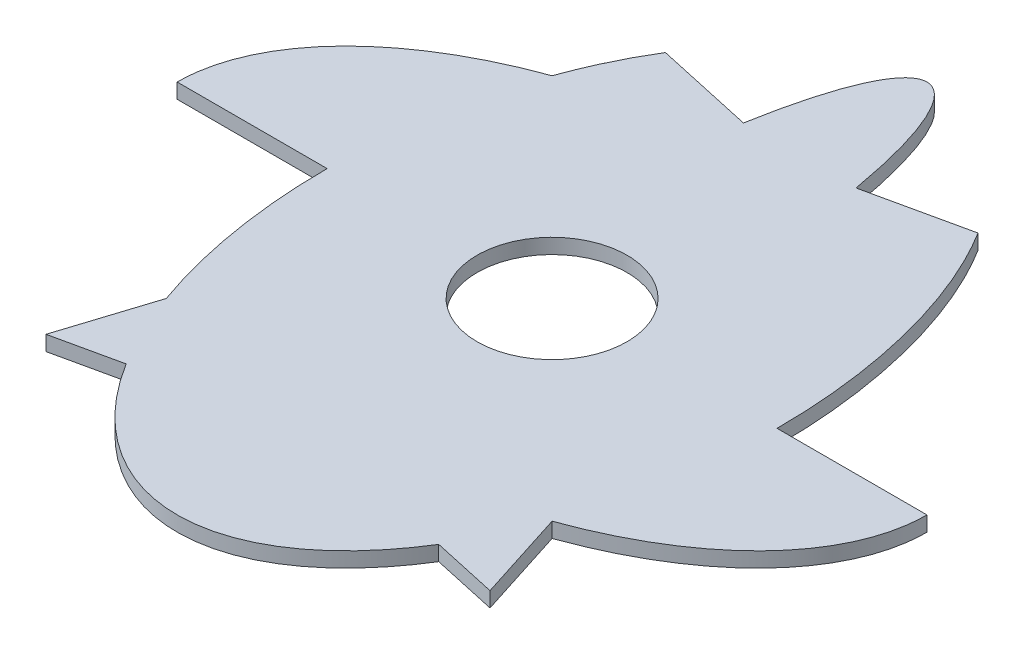
ISO-10303-21;
HEADER;
FILE_DESCRIPTION(('STEP AP214'),'2;1');
FILE_NAME('part.step','',(''),(''),'','','');
FILE_SCHEMA(('AUTOMOTIVE_DESIGN { 1 0 10303 214 1 1 1 1 }'));
ENDSEC;
DATA;
#1=APPLICATION_CONTEXT('core data for automotive mechanical design processes');
#2=APPLICATION_PROTOCOL_DEFINITION('international standard','automotive_design',2000,#1);
#3=PRODUCT_CONTEXT('',#1,'mechanical');
#4=PRODUCT('Part','Part','',(#3));
#5=PRODUCT_RELATED_PRODUCT_CATEGORY('part','',(#4));
#6=PRODUCT_DEFINITION_FORMATION('','',#4);
#7=PRODUCT_DEFINITION_CONTEXT('part definition',#1,'design');
#8=PRODUCT_DEFINITION('design','',#6,#7);
#9=PRODUCT_DEFINITION_SHAPE('','',#8);
#10=(LENGTH_UNIT() NAMED_UNIT(*) SI_UNIT(.MILLI.,.METRE.));
#11=(NAMED_UNIT(*) PLANE_ANGLE_UNIT() SI_UNIT($,.RADIAN.));
#12=(NAMED_UNIT(*) SI_UNIT($,.STERADIAN.) SOLID_ANGLE_UNIT());
#13=UNCERTAINTY_MEASURE_WITH_UNIT(LENGTH_MEASURE(1.E-05),#10,'distance_accuracy_value','');
#14=(GEOMETRIC_REPRESENTATION_CONTEXT(3) GLOBAL_UNCERTAINTY_ASSIGNED_CONTEXT((#13)) GLOBAL_UNIT_ASSIGNED_CONTEXT((#10,
#11,#12)) REPRESENTATION_CONTEXT('',''));
#15=CARTESIAN_POINT('',(0.,0.,0.));
#16=DIRECTION('',(0.,0.,1.));
#17=DIRECTION('',(1.,0.,0.));
#18=AXIS2_PLACEMENT_3D('',#15,#16,#17);
#19=CARTESIAN_POINT('',(6.57913665277068,2.,29.9329249695814));
#20=DIRECTION('',(0.214671716521423,0.,0.976686261870078));
#21=DIRECTION('',(0.976686261870078,0.,-0.214671716521423));
#22=AXIS2_PLACEMENT_3D('',#19,#20,#21);
#23=PLANE('',#22);
#24=DIRECTION('',(-0.976686261870078,0.,0.214671716521423));
#25=VECTOR('',#24,1.);
#26=CARTESIAN_POINT('',(6.57913665277068,0.,29.9329249695814));
#27=LINE('',#26,#25);
#28=CARTESIAN_POINT('',(-20.8438524144672,0.,35.9603877946859));
#29=VERTEX_POINT('',#28);
#30=CARTESIAN_POINT('',(-29.6078262731896,0.,37.8866740395631));
#31=VERTEX_POINT('',#30);
#32=EDGE_CURVE('E323',#29,#31,#27,.T.);
#33=ORIENTED_EDGE('',*,*,#32,.F.);
#34=DIRECTION('',(0.,-1.,0.));
#35=VECTOR('',#34,1.);
#36=CARTESIAN_POINT('',(-20.8438524144672,2.,35.9603877946859));
#37=LINE('',#36,#35);
#38=CARTESIAN_POINT('',(-20.8438524144672,2.,35.9603877946859));
#39=VERTEX_POINT('',#38);
#40=EDGE_CURVE('E11',#39,#29,#37,.T.);
#41=ORIENTED_EDGE('',*,*,#40,.F.);
#42=DIRECTION('',(-0.976686261870078,0.,0.214671716521423));
#43=VECTOR('',#42,1.);
#44=CARTESIAN_POINT('',(6.57913665277068,2.,29.9329249695814));
#45=LINE('',#44,#43);
#46=CARTESIAN_POINT('',(-29.6078262731896,2.,37.8866740395631));
#47=VERTEX_POINT('',#46);
#48=EDGE_CURVE('E246',#39,#47,#45,.T.);
#49=ORIENTED_EDGE('',*,*,#48,.T.);
#50=DIRECTION('',(0.,-1.,0.));
#51=VECTOR('',#50,1.);
#52=CARTESIAN_POINT('',(-29.6078262731896,2.,37.8866740395631));
#53=LINE('',#52,#51);
#54=EDGE_CURVE('E51',#47,#31,#53,.T.);
#55=ORIENTED_EDGE('',*,*,#54,.T.);
#56=EDGE_LOOP('',(#33,#41,#49,#55));
#57=FACE_BOUND('',#56,.T.);
#58=ADVANCED_FACE('F35',(#57),#23,.T.);
#59=CARTESIAN_POINT('',(0.,2.,0.));
#60=DIRECTION('',(0.,1.,0.));
#61=DIRECTION('',(0.,0.,1.));
#62=AXIS2_PLACEMENT_3D('',#59,#60,#61);
#63=ELLIPSE('',#62,50.,30.);
#64=DIRECTION('',(0.,-1.,0.));
#65=VECTOR('',#64,1.);
#66=SURFACE_OF_LINEAR_EXTRUSION('',#63,#65);
#67=CARTESIAN_POINT('',(0.,0.,0.));
#68=DIRECTION('',(0.,1.,0.));
#69=DIRECTION('',(0.,0.,1.));
#70=AXIS2_PLACEMENT_3D('',#67,#68,#69);
#71=ELLIPSE('',#70,50.,30.);
#72=CARTESIAN_POINT('',(20.8438524144672,0.,35.9603877946859));
#73=VERTEX_POINT('',#72);
#74=EDGE_CURVE('E320',#29,#73,#71,.T.);
#75=ORIENTED_EDGE('',*,*,#74,.T.);
#76=DIRECTION('',(0.,-1.,0.));
#77=VECTOR('',#76,1.);
#78=CARTESIAN_POINT('',(20.8438524144672,2.,35.9603877946859));
#79=LINE('',#78,#77);
#80=CARTESIAN_POINT('',(20.8438524144672,2.,35.9603877946859));
#81=VERTEX_POINT('',#80);
#82=EDGE_CURVE('E43',#81,#73,#79,.T.);
#83=ORIENTED_EDGE('',*,*,#82,.F.);
#84=EDGE_CURVE('E242',#39,#81,#63,.T.);
#85=ORIENTED_EDGE('',*,*,#84,.F.);
#86=ORIENTED_EDGE('',*,*,#40,.T.);
#87=EDGE_LOOP('',(#75,#83,#85,#86));
#88=FACE_BOUND('',#87,.T.);
#89=ADVANCED_FACE('F237',(#88),#66,.F.);
#90=CARTESIAN_POINT('',(-6.57913665277068,2.,29.9329249695814));
#91=DIRECTION('',(0.214671716521423,0.,-0.976686261870078));
#92=DIRECTION('',(-0.976686261870078,0.,-0.214671716521423));
#93=AXIS2_PLACEMENT_3D('',#90,#91,#92);
#94=PLANE('',#93);
#95=DIRECTION('',(0.976686261870078,0.,0.214671716521423));
#96=VECTOR('',#95,1.);
#97=CARTESIAN_POINT('',(-6.57913665277068,0.,29.9329249695814));
#98=LINE('',#97,#96);
#99=CARTESIAN_POINT('',(29.6078262731896,0.,37.8866740395631));
#100=VERTEX_POINT('',#99);
#101=EDGE_CURVE('E315',#73,#100,#98,.T.);
#102=ORIENTED_EDGE('',*,*,#101,.T.);
#103=DIRECTION('',(0.,-1.,0.));
#104=VECTOR('',#103,1.);
#105=CARTESIAN_POINT('',(29.6078262731896,2.,37.8866740395631));
#106=LINE('',#105,#104);
#107=CARTESIAN_POINT('',(29.6078262731896,2.,37.8866740395631));
#108=VERTEX_POINT('',#107);
#109=EDGE_CURVE('E261',#108,#100,#106,.T.);
#110=ORIENTED_EDGE('',*,*,#109,.F.);
#111=DIRECTION('',(0.976686261870078,0.,0.214671716521423));
#112=VECTOR('',#111,1.);
#113=CARTESIAN_POINT('',(-6.57913665277068,2.,29.9329249695814));
#114=LINE('',#113,#112);
#115=EDGE_CURVE('E245',#81,#108,#114,.T.);
#116=ORIENTED_EDGE('',*,*,#115,.F.);
#117=ORIENTED_EDGE('',*,*,#82,.T.);
#118=EDGE_LOOP('',(#102,#110,#116,#117));
#119=FACE_BOUND('',#118,.T.);
#120=ADVANCED_FACE('F234',(#119),#94,.F.);
#121=CARTESIAN_POINT('',(15.8914343916397,2.,-5.07380600599683));
#122=DIRECTION('',(-0.952623234761932,0.,0.304152877007126));
#123=DIRECTION('',(0.304152877007126,0.,0.952623234761932));
#124=AXIS2_PLACEMENT_3D('',#121,#122,#123);
#125=PLANE('',#124);
#126=DIRECTION('',(-0.304152877007126,0.,-0.952623234761932));
#127=VECTOR('',#126,1.);
#128=CARTESIAN_POINT('',(15.8914343916397,0.,-5.07380600599683));
#129=LINE('',#128,#127);
#130=CARTESIAN_POINT('',(25.7247877713763,0.,25.7247877713763));
#131=VERTEX_POINT('',#130);
#132=EDGE_CURVE('E258',#100,#131,#129,.T.);
#133=ORIENTED_EDGE('',*,*,#132,.T.);
#134=DIRECTION('',(0.,-1.,0.));
#135=VECTOR('',#134,1.);
#136=CARTESIAN_POINT('',(25.7247877713763,2.,25.7247877713763));
#137=LINE('',#136,#135);
#138=CARTESIAN_POINT('',(25.7247877713763,2.,25.7247877713763));
#139=VERTEX_POINT('',#138);
#140=EDGE_CURVE('E256',#139,#131,#137,.T.);
#141=ORIENTED_EDGE('',*,*,#140,.F.);
#142=DIRECTION('',(-0.304152877007126,0.,-0.952623234761932));
#143=VECTOR('',#142,1.);
#144=CARTESIAN_POINT('',(15.8914343916397,2.,-5.07380600599683));
#145=LINE('',#144,#143);
#146=EDGE_CURVE('E225',#108,#139,#145,.T.);
#147=ORIENTED_EDGE('',*,*,#146,.F.);
#148=ORIENTED_EDGE('',*,*,#109,.T.);
#149=EDGE_LOOP('',(#133,#141,#147,#148));
#150=FACE_BOUND('',#149,.T.);
#151=ADVANCED_FACE('F230',(#150),#125,.F.);
#152=CARTESIAN_POINT('',(0.,2.,0.));
#153=DIRECTION('',(0.,1.,0.));
#154=DIRECTION('',(1.,0.,0.));
#155=AXIS2_PLACEMENT_3D('',#152,#153,#154);
#156=ELLIPSE('',#155,50.,30.);
#157=DIRECTION('',(0.,-1.,0.));
#158=VECTOR('',#157,1.);
#159=SURFACE_OF_LINEAR_EXTRUSION('',#156,#158);
#160=CARTESIAN_POINT('',(0.,0.,0.));
#161=DIRECTION('',(0.,1.,0.));
#162=DIRECTION('',(1.,0.,0.));
#163=AXIS2_PLACEMENT_3D('',#160,#161,#162);
#164=ELLIPSE('',#163,50.,30.);
#165=CARTESIAN_POINT('',(50.,0.,0.));
#166=VERTEX_POINT('',#165);
#167=EDGE_CURVE('E264',#131,#166,#164,.T.);
#168=ORIENTED_EDGE('',*,*,#167,.T.);
#169=DIRECTION('',(0.,-1.,0.));
#170=VECTOR('',#169,1.);
#171=CARTESIAN_POINT('',(50.,2.,0.));
#172=LINE('',#171,#170);
#173=CARTESIAN_POINT('',(50.,2.,0.));
#174=VERTEX_POINT('',#173);
#175=EDGE_CURVE('E262',#174,#166,#172,.T.);
#176=ORIENTED_EDGE('',*,*,#175,.F.);
#177=EDGE_CURVE('E222',#139,#174,#156,.T.);
#178=ORIENTED_EDGE('',*,*,#177,.F.);
#179=ORIENTED_EDGE('',*,*,#140,.T.);
#180=EDGE_LOOP('',(#168,#176,#178,#179));
#181=FACE_BOUND('',#180,.T.);
#182=ADVANCED_FACE('F227',(#181),#159,.F.);
#183=CARTESIAN_POINT('',(0.,2.,0.));
#184=DIRECTION('',(0.,0.,-1.));
#185=DIRECTION('',(-1.,0.,0.));
#186=AXIS2_PLACEMENT_3D('',#183,#184,#185);
#187=PLANE('',#186);
#188=DIRECTION('',(1.,0.,0.));
#189=VECTOR('',#188,1.);
#190=CARTESIAN_POINT('',(0.,0.,0.));
#191=LINE('',#190,#189);
#192=CARTESIAN_POINT('',(30.,0.,0.));
#193=VERTEX_POINT('',#192);
#194=EDGE_CURVE('E328',#193,#166,#191,.T.);
#195=ORIENTED_EDGE('',*,*,#194,.F.);
#196=DIRECTION('',(0.,-1.,0.));
#197=VECTOR('',#196,1.);
#198=CARTESIAN_POINT('',(30.,2.,0.));
#199=LINE('',#198,#197);
#200=CARTESIAN_POINT('',(30.,2.,0.));
#201=VERTEX_POINT('',#200);
#202=EDGE_CURVE('E268',#201,#193,#199,.T.);
#203=ORIENTED_EDGE('',*,*,#202,.F.);
#204=DIRECTION('',(1.,0.,0.));
#205=VECTOR('',#204,1.);
#206=CARTESIAN_POINT('',(0.,2.,0.));
#207=LINE('',#206,#205);
#208=EDGE_CURVE('E219',#201,#174,#207,.T.);
#209=ORIENTED_EDGE('',*,*,#208,.T.);
#210=ORIENTED_EDGE('',*,*,#175,.T.);
#211=EDGE_LOOP('',(#195,#203,#209,#210));
#212=FACE_BOUND('',#211,.T.);
#213=ADVANCED_FACE('F213',(#212),#187,.T.);
#214=CARTESIAN_POINT('',(0.,2.,0.));
#215=DIRECTION('',(0.,1.,0.));
#216=DIRECTION('',(0.,0.,1.));
#217=AXIS2_PLACEMENT_3D('',#214,#215,#216);
#218=ELLIPSE('',#217,50.,30.);
#219=DIRECTION('',(0.,-1.,0.));
#220=VECTOR('',#219,1.);
#221=SURFACE_OF_LINEAR_EXTRUSION('',#218,#220);
#222=CARTESIAN_POINT('',(0.,0.,0.));
#223=DIRECTION('',(0.,1.,0.));
#224=DIRECTION('',(0.,0.,1.));
#225=AXIS2_PLACEMENT_3D('',#222,#223,#224);
#226=ELLIPSE('',#225,50.,30.);
#227=CARTESIAN_POINT('',(20.8438524144672,0.,-35.9603877946859));
#228=VERTEX_POINT('',#227);
#229=EDGE_CURVE('E277',#193,#228,#226,.T.);
#230=ORIENTED_EDGE('',*,*,#229,.T.);
#231=DIRECTION('',(0.,-1.,0.));
#232=VECTOR('',#231,1.);
#233=CARTESIAN_POINT('',(20.8438524144672,2.,-35.9603877946859));
#234=LINE('',#233,#232);
#235=CARTESIAN_POINT('',(20.8438524144672,2.,-35.9603877946859));
#236=VERTEX_POINT('',#235);
#237=EDGE_CURVE('E275',#236,#228,#234,.T.);
#238=ORIENTED_EDGE('',*,*,#237,.F.);
#239=EDGE_CURVE('E216',#201,#236,#218,.T.);
#240=ORIENTED_EDGE('',*,*,#239,.F.);
#241=ORIENTED_EDGE('',*,*,#202,.T.);
#242=EDGE_LOOP('',(#230,#238,#240,#241));
#243=FACE_BOUND('',#242,.T.);
#244=ADVANCED_FACE('F209',(#243),#221,.F.);
#245=CARTESIAN_POINT('',(-6.57913665277068,2.,-29.9329249695814));
#246=DIRECTION('',(-0.214671716521423,0.,-0.976686261870078));
#247=DIRECTION('',(-0.976686261870078,0.,0.214671716521423));
#248=AXIS2_PLACEMENT_3D('',#245,#246,#247);
#249=PLANE('',#248);
#250=DIRECTION('',(0.976686261870078,0.,-0.214671716521423));
#251=VECTOR('',#250,1.);
#252=CARTESIAN_POINT('',(-6.57913665277068,0.,-29.9329249695814));
#253=LINE('',#252,#251);
#254=CARTESIAN_POINT('',(7.50753568355826,0.,-33.0291189558923));
#255=VERTEX_POINT('',#254);
#256=EDGE_CURVE('E283',#255,#228,#253,.T.);
#257=ORIENTED_EDGE('',*,*,#256,.F.);
#258=DIRECTION('',(0.,-1.,0.));
#259=VECTOR('',#258,1.);
#260=CARTESIAN_POINT('',(7.50753568355826,2.,-33.0291189558923));
#261=LINE('',#260,#259);
#262=CARTESIAN_POINT('',(7.50753568355826,2.,-33.0291189558923));
#263=VERTEX_POINT('',#262);
#264=EDGE_CURVE('E280',#263,#255,#261,.T.);
#265=ORIENTED_EDGE('',*,*,#264,.F.);
#266=DIRECTION('',(0.976686261870078,0.,-0.214671716521423));
#267=VECTOR('',#266,1.);
#268=CARTESIAN_POINT('',(-6.57913665277068,2.,-29.9329249695814));
#269=LINE('',#268,#267);
#270=EDGE_CURVE('E198',#263,#236,#269,.T.);
#271=ORIENTED_EDGE('',*,*,#270,.T.);
#272=ORIENTED_EDGE('',*,*,#237,.T.);
#273=EDGE_LOOP('',(#257,#265,#271,#272));
#274=FACE_BOUND('',#273,.T.);
#275=ADVANCED_FACE('F205',(#274),#249,.T.);
#276=CARTESIAN_POINT('',(0.,2.,0.));
#277=DIRECTION('',(0.,1.,0.));
#278=DIRECTION('',(0.,0.,-1.));
#279=AXIS2_PLACEMENT_3D('',#276,#277,#278);
#280=ELLIPSE('',#279,50.,10.);
#281=DIRECTION('',(0.,-1.,0.));
#282=VECTOR('',#281,1.);
#283=SURFACE_OF_LINEAR_EXTRUSION('',#280,#282);
#284=CARTESIAN_POINT('',(0.,0.,0.));
#285=DIRECTION('',(0.,1.,0.));
#286=DIRECTION('',(0.,0.,-1.));
#287=AXIS2_PLACEMENT_3D('',#284,#285,#286);
#288=ELLIPSE('',#287,50.,10.);
#289=CARTESIAN_POINT('',(-7.50753568355826,0.,-33.0291189558923));
#290=VERTEX_POINT('',#289);
#291=EDGE_CURVE('E332',#255,#290,#288,.T.);
#292=ORIENTED_EDGE('',*,*,#291,.T.);
#293=DIRECTION('',(0.,-1.,0.));
#294=VECTOR('',#293,1.);
#295=CARTESIAN_POINT('',(-7.50753568355826,2.,-33.0291189558923));
#296=LINE('',#295,#294);
#297=CARTESIAN_POINT('',(-7.50753568355826,2.,-33.0291189558923));
#298=VERTEX_POINT('',#297);
#299=EDGE_CURVE('E285',#298,#290,#296,.T.);
#300=ORIENTED_EDGE('',*,*,#299,.F.);
#301=EDGE_CURVE('E195',#263,#298,#280,.T.);
#302=ORIENTED_EDGE('',*,*,#301,.F.);
#303=ORIENTED_EDGE('',*,*,#264,.T.);
#304=EDGE_LOOP('',(#292,#300,#302,#303));
#305=FACE_BOUND('',#304,.T.);
#306=ADVANCED_FACE('F201',(#305),#283,.F.);
#307=CARTESIAN_POINT('',(6.57913665277068,2.,-29.9329249695814));
#308=DIRECTION('',(-0.214671716521423,0.,0.976686261870078));
#309=DIRECTION('',(0.976686261870078,0.,0.214671716521423));
#310=AXIS2_PLACEMENT_3D('',#307,#308,#309);
#311=PLANE('',#310);
#312=DIRECTION('',(-0.976686261870078,0.,-0.214671716521423));
#313=VECTOR('',#312,1.);
#314=CARTESIAN_POINT('',(6.57913665277068,0.,-29.9329249695814));
#315=LINE('',#314,#313);
#316=CARTESIAN_POINT('',(-20.8438524144672,0.,-35.9603877946859));
#317=VERTEX_POINT('',#316);
#318=EDGE_CURVE('E297',#290,#317,#315,.T.);
#319=ORIENTED_EDGE('',*,*,#318,.T.);
#320=DIRECTION('',(0.,-1.,0.));
#321=VECTOR('',#320,1.);
#322=CARTESIAN_POINT('',(-20.8438524144672,2.,-35.9603877946859));
#323=LINE('',#322,#321);
#324=CARTESIAN_POINT('',(-20.8438524144672,2.,-35.9603877946859));
#325=VERTEX_POINT('',#324);
#326=EDGE_CURVE('E295',#325,#317,#323,.T.);
#327=ORIENTED_EDGE('',*,*,#326,.F.);
#328=DIRECTION('',(-0.976686261870078,0.,-0.214671716521423));
#329=VECTOR('',#328,1.);
#330=CARTESIAN_POINT('',(6.57913665277068,2.,-29.9329249695814));
#331=LINE('',#330,#329);
#332=EDGE_CURVE('E193',#298,#325,#331,.T.);
#333=ORIENTED_EDGE('',*,*,#332,.F.);
#334=ORIENTED_EDGE('',*,*,#299,.T.);
#335=EDGE_LOOP('',(#319,#327,#333,#334));
#336=FACE_BOUND('',#335,.T.);
#337=ADVANCED_FACE('F204',(#336),#311,.F.);
#338=CARTESIAN_POINT('',(0.,2.,0.));
#339=DIRECTION('',(0.,1.,0.));
#340=DIRECTION('',(0.,0.,1.));
#341=AXIS2_PLACEMENT_3D('',#338,#339,#340);
#342=ELLIPSE('',#341,50.,30.);
#343=DIRECTION('',(0.,-1.,0.));
#344=VECTOR('',#343,1.);
#345=SURFACE_OF_LINEAR_EXTRUSION('',#342,#344);
#346=CARTESIAN_POINT('',(0.,0.,0.));
#347=DIRECTION('',(0.,1.,0.));
#348=DIRECTION('',(0.,0.,1.));
#349=AXIS2_PLACEMENT_3D('',#346,#347,#348);
#350=ELLIPSE('',#349,50.,30.);
#351=CARTESIAN_POINT('',(-25.7247877713763,0.,-25.7247877713763));
#352=VERTEX_POINT('',#351);
#353=EDGE_CURVE('E303',#317,#352,#350,.T.);
#354=ORIENTED_EDGE('',*,*,#353,.T.);
#355=DIRECTION('',(0.,-1.,0.));
#356=VECTOR('',#355,1.);
#357=CARTESIAN_POINT('',(-25.7247877713763,2.,-25.7247877713763));
#358=LINE('',#357,#356);
#359=CARTESIAN_POINT('',(-25.7247877713763,2.,-25.7247877713763));
#360=VERTEX_POINT('',#359);
#361=EDGE_CURVE('E300',#360,#352,#358,.T.);
#362=ORIENTED_EDGE('',*,*,#361,.F.);
#363=EDGE_CURVE('E190',#325,#360,#342,.T.);
#364=ORIENTED_EDGE('',*,*,#363,.F.);
#365=ORIENTED_EDGE('',*,*,#326,.T.);
#366=EDGE_LOOP('',(#354,#362,#364,#365));
#367=FACE_BOUND('',#366,.T.);
#368=ADVANCED_FACE('F185',(#367),#345,.F.);
#369=CARTESIAN_POINT('',(0.,2.,0.));
#370=DIRECTION('',(0.,1.,0.));
#371=DIRECTION('',(1.,0.,0.));
#372=AXIS2_PLACEMENT_3D('',#369,#370,#371);
#373=ELLIPSE('',#372,50.,30.);
#374=DIRECTION('',(0.,-1.,0.));
#375=VECTOR('',#374,1.);
#376=SURFACE_OF_LINEAR_EXTRUSION('',#373,#375);
#377=CARTESIAN_POINT('',(0.,0.,0.));
#378=DIRECTION('',(0.,1.,0.));
#379=DIRECTION('',(1.,0.,0.));
#380=AXIS2_PLACEMENT_3D('',#377,#378,#379);
#381=ELLIPSE('',#380,50.,30.);
#382=CARTESIAN_POINT('',(-50.,0.,0.));
#383=VERTEX_POINT('',#382);
#384=EDGE_CURVE('E306',#352,#383,#381,.T.);
#385=ORIENTED_EDGE('',*,*,#384,.T.);
#386=DIRECTION('',(0.,-1.,0.));
#387=VECTOR('',#386,1.);
#388=CARTESIAN_POINT('',(-50.,2.,0.));
#389=LINE('',#388,#387);
#390=CARTESIAN_POINT('',(-50.,2.,0.));
#391=VERTEX_POINT('',#390);
#392=EDGE_CURVE('E164',#391,#383,#389,.T.);
#393=ORIENTED_EDGE('',*,*,#392,.F.);
#394=EDGE_CURVE('E152',#360,#391,#373,.T.);
#395=ORIENTED_EDGE('',*,*,#394,.F.);
#396=ORIENTED_EDGE('',*,*,#361,.T.);
#397=EDGE_LOOP('',(#385,#393,#395,#396));
#398=FACE_BOUND('',#397,.T.);
#399=ADVANCED_FACE('F182',(#398),#376,.F.);
#400=CARTESIAN_POINT('',(0.,2.,0.));
#401=DIRECTION('',(0.,0.,-1.));
#402=DIRECTION('',(-1.,0.,0.));
#403=AXIS2_PLACEMENT_3D('',#400,#401,#402);
#404=PLANE('',#403);
#405=DIRECTION('',(1.,0.,0.));
#406=VECTOR('',#405,1.);
#407=CARTESIAN_POINT('',(0.,0.,0.));
#408=LINE('',#407,#406);
#409=CARTESIAN_POINT('',(-30.,0.,0.));
#410=VERTEX_POINT('',#409);
#411=EDGE_CURVE('E161',#383,#410,#408,.T.);
#412=ORIENTED_EDGE('',*,*,#411,.T.);
#413=DIRECTION('',(0.,-1.,0.));
#414=VECTOR('',#413,1.);
#415=CARTESIAN_POINT('',(-30.,2.,0.));
#416=LINE('',#415,#414);
#417=CARTESIAN_POINT('',(-30.,2.,0.));
#418=VERTEX_POINT('',#417);
#419=EDGE_CURVE('E158',#418,#410,#416,.T.);
#420=ORIENTED_EDGE('',*,*,#419,.F.);
#421=DIRECTION('',(1.,0.,0.));
#422=VECTOR('',#421,1.);
#423=CARTESIAN_POINT('',(0.,2.,0.));
#424=LINE('',#423,#422);
#425=EDGE_CURVE('E143',#391,#418,#424,.T.);
#426=ORIENTED_EDGE('',*,*,#425,.F.);
#427=ORIENTED_EDGE('',*,*,#392,.T.);
#428=EDGE_LOOP('',(#412,#420,#426,#427));
#429=FACE_BOUND('',#428,.T.);
#430=ADVANCED_FACE('F159',(#429),#404,.F.);
#431=CARTESIAN_POINT('',(0.,2.,0.));
#432=DIRECTION('',(0.,1.,0.));
#433=DIRECTION('',(0.,0.,1.));
#434=AXIS2_PLACEMENT_3D('',#431,#432,#433);
#435=ELLIPSE('',#434,50.,30.);
#436=DIRECTION('',(0.,-1.,0.));
#437=VECTOR('',#436,1.);
#438=SURFACE_OF_LINEAR_EXTRUSION('',#435,#437);
#439=CARTESIAN_POINT('',(0.,0.,0.));
#440=DIRECTION('',(0.,1.,0.));
#441=DIRECTION('',(0.,0.,1.));
#442=AXIS2_PLACEMENT_3D('',#439,#440,#441);
#443=ELLIPSE('',#442,50.,30.);
#444=CARTESIAN_POINT('',(-25.7247877713763,0.,25.7247877713763));
#445=VERTEX_POINT('',#444);
#446=EDGE_CURVE('E338',#410,#445,#443,.T.);
#447=ORIENTED_EDGE('',*,*,#446,.T.);
#448=DIRECTION('',(0.,-1.,0.));
#449=VECTOR('',#448,1.);
#450=CARTESIAN_POINT('',(-25.7247877713763,2.,25.7247877713763));
#451=LINE('',#450,#449);
#452=CARTESIAN_POINT('',(-25.7247877713763,2.,25.7247877713763));
#453=VERTEX_POINT('',#452);
#454=EDGE_CURVE('E98',#453,#445,#451,.T.);
#455=ORIENTED_EDGE('',*,*,#454,.F.);
#456=EDGE_CURVE('E150',#418,#453,#435,.T.);
#457=ORIENTED_EDGE('',*,*,#456,.F.);
#458=ORIENTED_EDGE('',*,*,#419,.T.);
#459=EDGE_LOOP('',(#447,#455,#457,#458));
#460=FACE_BOUND('',#459,.T.);
#461=ADVANCED_FACE('F166',(#460),#438,.F.);
#462=CARTESIAN_POINT('',(-15.8914343916397,2.,-5.07380600599683));
#463=DIRECTION('',(-0.952623234761932,0.,-0.304152877007126));
#464=DIRECTION('',(-0.304152877007126,0.,0.952623234761932));
#465=AXIS2_PLACEMENT_3D('',#462,#463,#464);
#466=PLANE('',#465);
#467=DIRECTION('',(0.304152877007126,0.,-0.952623234761932));
#468=VECTOR('',#467,1.);
#469=CARTESIAN_POINT('',(-15.8914343916397,0.,-5.07380600599683));
#470=LINE('',#469,#468);
#471=EDGE_CURVE('E340',#31,#445,#470,.T.);
#472=ORIENTED_EDGE('',*,*,#471,.F.);
#473=ORIENTED_EDGE('',*,*,#54,.F.);
#474=DIRECTION('',(0.304152877007126,0.,-0.952623234761932));
#475=VECTOR('',#474,1.);
#476=CARTESIAN_POINT('',(-15.8914343916397,2.,-5.07380600599683));
#477=LINE('',#476,#475);
#478=EDGE_CURVE('E167',#47,#453,#477,.T.);
#479=ORIENTED_EDGE('',*,*,#478,.T.);
#480=ORIENTED_EDGE('',*,*,#454,.T.);
#481=EDGE_LOOP('',(#472,#473,#479,#480));
#482=FACE_BOUND('',#481,.T.);
#483=ADVANCED_FACE('F178',(#482),#466,.T.);
#484=CARTESIAN_POINT('',(0.,2.,0.));
#485=DIRECTION('',(0.,-1.,0.));
#486=DIRECTION('',(0.,0.,-1.));
#487=AXIS2_PLACEMENT_3D('',#484,#485,#486);
#488=CYLINDRICAL_SURFACE('',#487,10.);
#489=CARTESIAN_POINT('',(0.,2.,0.));
#490=DIRECTION('',(0.,1.,0.));
#491=DIRECTION('',(0.,0.,1.));
#492=AXIS2_PLACEMENT_3D('',#489,#490,#491);
#493=CIRCLE('',#492,10.);
#494=CARTESIAN_POINT('',(0.,2.,10.));
#495=VERTEX_POINT('',#494);
#496=EDGE_CURVE('E169',#495,#495,#493,.T.);
#497=ORIENTED_EDGE('',*,*,#496,.T.);
#498=EDGE_LOOP('',(#497));
#499=FACE_BOUND('',#498,.T.);
#500=CARTESIAN_POINT('',(0.,0.,0.));
#501=DIRECTION('',(0.,1.,0.));
#502=DIRECTION('',(0.,0.,1.));
#503=AXIS2_PLACEMENT_3D('',#500,#501,#502);
#504=CIRCLE('',#503,10.);
#505=CARTESIAN_POINT('',(0.,0.,10.));
#506=VERTEX_POINT('',#505);
#507=EDGE_CURVE('E343',#506,#506,#504,.T.);
#508=ORIENTED_EDGE('',*,*,#507,.F.);
#509=EDGE_LOOP('',(#508));
#510=FACE_BOUND('',#509,.T.);
#511=ADVANCED_FACE('F350',(#499,#510),#488,.F.);
#512=CARTESIAN_POINT('',(0.,2.,0.));
#513=DIRECTION('',(0.,1.,0.));
#514=DIRECTION('',(0.,0.,1.));
#515=AXIS2_PLACEMENT_3D('',#512,#513,#514);
#516=PLANE('',#515);
#517=ORIENTED_EDGE('',*,*,#48,.F.);
#518=ORIENTED_EDGE('',*,*,#84,.T.);
#519=ORIENTED_EDGE('',*,*,#115,.T.);
#520=ORIENTED_EDGE('',*,*,#146,.T.);
#521=ORIENTED_EDGE('',*,*,#177,.T.);
#522=ORIENTED_EDGE('',*,*,#208,.F.);
#523=ORIENTED_EDGE('',*,*,#239,.T.);
#524=ORIENTED_EDGE('',*,*,#270,.F.);
#525=ORIENTED_EDGE('',*,*,#301,.T.);
#526=ORIENTED_EDGE('',*,*,#332,.T.);
#527=ORIENTED_EDGE('',*,*,#363,.T.);
#528=ORIENTED_EDGE('',*,*,#394,.T.);
#529=ORIENTED_EDGE('',*,*,#425,.T.);
#530=ORIENTED_EDGE('',*,*,#456,.T.);
#531=ORIENTED_EDGE('',*,*,#478,.F.);
#532=EDGE_LOOP('',(#517,#518,#519,#520,#521,#522,#523,#524,#525,#526,#527,#528,#529,#530,#531));
#533=FACE_BOUND('',#532,.T.);
#534=ORIENTED_EDGE('',*,*,#496,.F.);
#535=EDGE_LOOP('',(#534));
#536=FACE_BOUND('',#535,.T.);
#537=ADVANCED_FACE('F146',(#533,#536),#516,.T.);
#538=CARTESIAN_POINT('',(0.,0.,0.));
#539=DIRECTION('',(0.,1.,0.));
#540=DIRECTION('',(0.,0.,1.));
#541=AXIS2_PLACEMENT_3D('',#538,#539,#540);
#542=PLANE('',#541);
#543=ORIENTED_EDGE('',*,*,#32,.T.);
#544=ORIENTED_EDGE('',*,*,#471,.T.);
#545=ORIENTED_EDGE('',*,*,#446,.F.);
#546=ORIENTED_EDGE('',*,*,#411,.F.);
#547=ORIENTED_EDGE('',*,*,#384,.F.);
#548=ORIENTED_EDGE('',*,*,#353,.F.);
#549=ORIENTED_EDGE('',*,*,#318,.F.);
#550=ORIENTED_EDGE('',*,*,#291,.F.);
#551=ORIENTED_EDGE('',*,*,#256,.T.);
#552=ORIENTED_EDGE('',*,*,#229,.F.);
#553=ORIENTED_EDGE('',*,*,#194,.T.);
#554=ORIENTED_EDGE('',*,*,#167,.F.);
#555=ORIENTED_EDGE('',*,*,#132,.F.);
#556=ORIENTED_EDGE('',*,*,#101,.F.);
#557=ORIENTED_EDGE('',*,*,#74,.F.);
#558=EDGE_LOOP('',(#543,#544,#545,#546,#547,#548,#549,#550,#551,#552,#553,#554,#555,#556,#557));
#559=FACE_BOUND('',#558,.T.);
#560=ORIENTED_EDGE('',*,*,#507,.T.);
#561=EDGE_LOOP('',(#560));
#562=FACE_BOUND('',#561,.T.);
#563=ADVANCED_FACE('F318',(#559,#562),#542,.F.);
#564=CLOSED_SHELL('',(#58,#89,#120,#151,#182,#213,#244,#275,#306,#337,#368,#399,#430,#461,#483,
#511,#537,#563));
#565=MANIFOLD_SOLID_BREP('B2',#564);
#566=ADVANCED_BREP_SHAPE_REPRESENTATION('',(#18,#565),#14);
#567=SHAPE_DEFINITION_REPRESENTATION(#9,#566);
ENDSEC;
END-ISO-10303-21;
